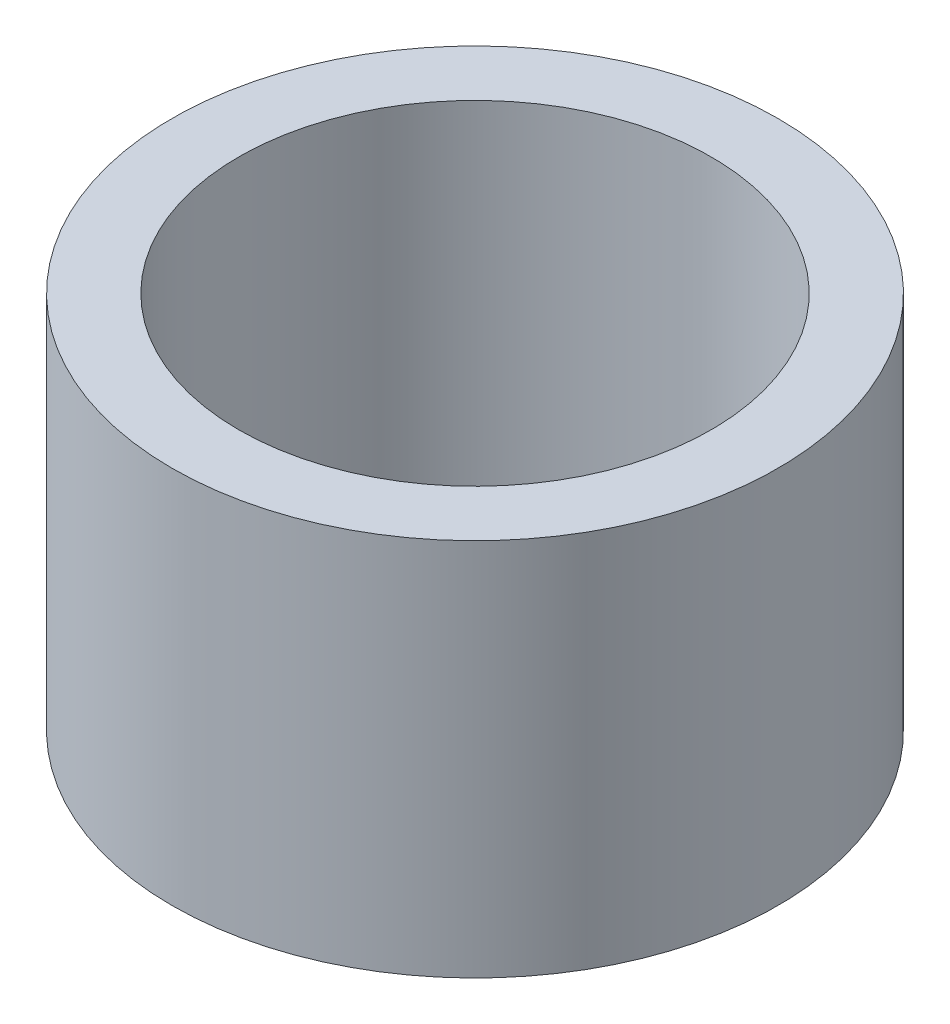
ISO-10303-21;
HEADER;
FILE_DESCRIPTION(('STEP AP214'),'2;1');
FILE_NAME('part.step','',(''),(''),'','','');
FILE_SCHEMA(('AUTOMOTIVE_DESIGN { 1 0 10303 214 1 1 1 1 }'));
ENDSEC;
DATA;
#1=APPLICATION_CONTEXT('core data for automotive mechanical design processes');
#2=APPLICATION_PROTOCOL_DEFINITION('international standard','automotive_design',2000,#1);
#3=PRODUCT_CONTEXT('',#1,'mechanical');
#4=PRODUCT('Part','Part','',(#3));
#5=PRODUCT_RELATED_PRODUCT_CATEGORY('part','',(#4));
#6=PRODUCT_DEFINITION_FORMATION('','',#4);
#7=PRODUCT_DEFINITION_CONTEXT('part definition',#1,'design');
#8=PRODUCT_DEFINITION('design','',#6,#7);
#9=PRODUCT_DEFINITION_SHAPE('','',#8);
#10=(LENGTH_UNIT() NAMED_UNIT(*) SI_UNIT(.MILLI.,.METRE.));
#11=(NAMED_UNIT(*) PLANE_ANGLE_UNIT() SI_UNIT($,.RADIAN.));
#12=(NAMED_UNIT(*) SI_UNIT($,.STERADIAN.) SOLID_ANGLE_UNIT());
#13=UNCERTAINTY_MEASURE_WITH_UNIT(LENGTH_MEASURE(1.E-05),#10,'distance_accuracy_value','');
#14=(GEOMETRIC_REPRESENTATION_CONTEXT(3) GLOBAL_UNCERTAINTY_ASSIGNED_CONTEXT((#13)) GLOBAL_UNIT_ASSIGNED_CONTEXT((#10,
#11,#12)) REPRESENTATION_CONTEXT('',''));
#15=CARTESIAN_POINT('',(0.,0.,0.));
#16=DIRECTION('',(0.,0.,1.));
#17=DIRECTION('',(1.,0.,0.));
#18=AXIS2_PLACEMENT_3D('',#15,#16,#17);
#19=CARTESIAN_POINT('',(0.,25.,0.));
#20=DIRECTION('',(0.,1.,0.));
#21=DIRECTION('',(0.,0.,1.));
#22=AXIS2_PLACEMENT_3D('',#19,#20,#21);
#23=PLANE('',#22);
#24=CARTESIAN_POINT('',(0.,25.,0.));
#25=DIRECTION('',(0.,1.,0.));
#26=DIRECTION('',(0.,0.,1.));
#27=AXIS2_PLACEMENT_3D('',#24,#25,#26);
#28=CIRCLE('',#27,20.);
#29=CARTESIAN_POINT('',(0.,25.,20.));
#30=VERTEX_POINT('',#29);
#31=EDGE_CURVE('E10',#30,#30,#28,.T.);
#32=ORIENTED_EDGE('',*,*,#31,.T.);
#33=EDGE_LOOP('',(#32));
#34=FACE_BOUND('',#33,.T.);
#35=CARTESIAN_POINT('',(0.,25.,0.));
#36=DIRECTION('',(0.,1.,0.));
#37=DIRECTION('',(0.,0.,1.));
#38=AXIS2_PLACEMENT_3D('',#35,#36,#37);
#39=CIRCLE('',#38,15.6);
#40=CARTESIAN_POINT('',(0.,25.,15.6));
#41=VERTEX_POINT('',#40);
#42=EDGE_CURVE('E42',#41,#41,#39,.T.);
#43=ORIENTED_EDGE('',*,*,#42,.F.);
#44=EDGE_LOOP('',(#43));
#45=FACE_BOUND('',#44,.T.);
#46=ADVANCED_FACE('F31',(#34,#45),#23,.T.);
#47=CARTESIAN_POINT('',(0.,0.,0.));
#48=DIRECTION('',(0.,1.,0.));
#49=DIRECTION('',(0.,0.,1.));
#50=AXIS2_PLACEMENT_3D('',#47,#48,#49);
#51=PLANE('',#50);
#52=CARTESIAN_POINT('',(0.,0.,0.));
#53=DIRECTION('',(0.,1.,0.));
#54=DIRECTION('',(0.,0.,1.));
#55=AXIS2_PLACEMENT_3D('',#52,#53,#54);
#56=CIRCLE('',#55,20.);
#57=CARTESIAN_POINT('',(0.,0.,20.));
#58=VERTEX_POINT('',#57);
#59=EDGE_CURVE('E35',#58,#58,#56,.T.);
#60=ORIENTED_EDGE('',*,*,#59,.F.);
#61=EDGE_LOOP('',(#60));
#62=FACE_BOUND('',#61,.T.);
#63=CARTESIAN_POINT('',(0.,0.,0.));
#64=DIRECTION('',(0.,1.,0.));
#65=DIRECTION('',(0.,0.,1.));
#66=AXIS2_PLACEMENT_3D('',#63,#64,#65);
#67=CIRCLE('',#66,15.6);
#68=CARTESIAN_POINT('',(0.,0.,15.6));
#69=VERTEX_POINT('',#68);
#70=EDGE_CURVE('E44',#69,#69,#67,.T.);
#71=ORIENTED_EDGE('',*,*,#70,.T.);
#72=EDGE_LOOP('',(#71));
#73=FACE_BOUND('',#72,.T.);
#74=ADVANCED_FACE('F54',(#62,#73),#51,.F.);
#75=CARTESIAN_POINT('',(0.,25.,0.));
#76=DIRECTION('',(0.,-1.,0.));
#77=DIRECTION('',(0.,0.,-1.));
#78=AXIS2_PLACEMENT_3D('',#75,#76,#77);
#79=CYLINDRICAL_SURFACE('',#78,20.);
#80=ORIENTED_EDGE('',*,*,#31,.F.);
#81=EDGE_LOOP('',(#80));
#82=FACE_BOUND('',#81,.T.);
#83=ORIENTED_EDGE('',*,*,#59,.T.);
#84=EDGE_LOOP('',(#83));
#85=FACE_BOUND('',#84,.T.);
#86=ADVANCED_FACE('F33',(#82,#85),#79,.T.);
#87=CARTESIAN_POINT('',(0.,25.,0.));
#88=DIRECTION('',(0.,-1.,0.));
#89=DIRECTION('',(0.,0.,-1.));
#90=AXIS2_PLACEMENT_3D('',#87,#88,#89);
#91=CYLINDRICAL_SURFACE('',#90,15.6);
#92=ORIENTED_EDGE('',*,*,#42,.T.);
#93=EDGE_LOOP('',(#92));
#94=FACE_BOUND('',#93,.T.);
#95=ORIENTED_EDGE('',*,*,#70,.F.);
#96=EDGE_LOOP('',(#95));
#97=FACE_BOUND('',#96,.T.);
#98=ADVANCED_FACE('F50',(#94,#97),#91,.F.);
#99=CLOSED_SHELL('',(#46,#74,#86,#98));
#100=MANIFOLD_SOLID_BREP('B2',#99);
#101=ADVANCED_BREP_SHAPE_REPRESENTATION('',(#18,#100),#14);
#102=SHAPE_DEFINITION_REPRESENTATION(#9,#101);
ENDSEC;
END-ISO-10303-21;
